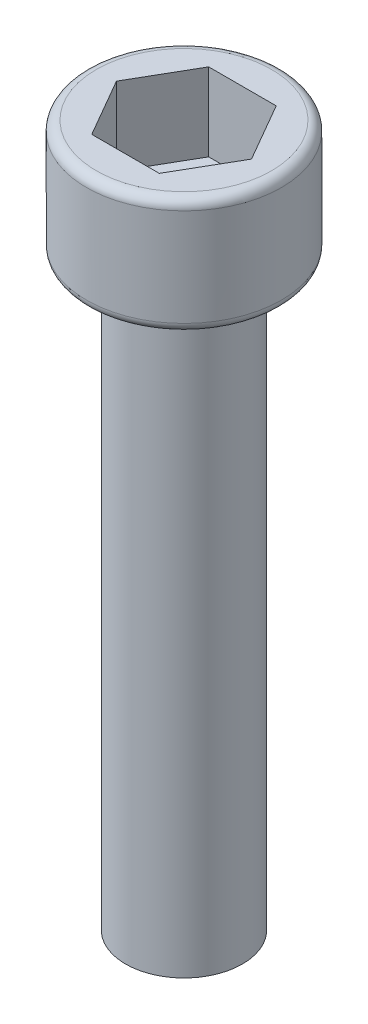
ISO-10303-21;
HEADER;
FILE_DESCRIPTION(('STEP AP214'),'2;1');
FILE_NAME('part.step','',(''),(''),'','','');
FILE_SCHEMA(('AUTOMOTIVE_DESIGN { 1 0 10303 214 1 1 1 1 }'));
ENDSEC;
DATA;
#1=APPLICATION_CONTEXT('core data for automotive mechanical design processes');
#2=APPLICATION_PROTOCOL_DEFINITION('international standard','automotive_design',2000,#1);
#3=PRODUCT_CONTEXT('',#1,'mechanical');
#4=PRODUCT('Part','Part','',(#3));
#5=PRODUCT_RELATED_PRODUCT_CATEGORY('part','',(#4));
#6=PRODUCT_DEFINITION_FORMATION('','',#4);
#7=PRODUCT_DEFINITION_CONTEXT('part definition',#1,'design');
#8=PRODUCT_DEFINITION('design','',#6,#7);
#9=PRODUCT_DEFINITION_SHAPE('','',#8);
#10=(LENGTH_UNIT() NAMED_UNIT(*) SI_UNIT(.MILLI.,.METRE.));
#11=(NAMED_UNIT(*) PLANE_ANGLE_UNIT() SI_UNIT($,.RADIAN.));
#12=(NAMED_UNIT(*) SI_UNIT($,.STERADIAN.) SOLID_ANGLE_UNIT());
#13=UNCERTAINTY_MEASURE_WITH_UNIT(LENGTH_MEASURE(1.E-05),#10,'distance_accuracy_value','');
#14=(GEOMETRIC_REPRESENTATION_CONTEXT(3) GLOBAL_UNCERTAINTY_ASSIGNED_CONTEXT((#13)) GLOBAL_UNIT_ASSIGNED_CONTEXT((#10,
#11,#12)) REPRESENTATION_CONTEXT('',''));
#15=CARTESIAN_POINT('',(0.,0.,0.));
#16=DIRECTION('',(0.,0.,1.));
#17=DIRECTION('',(1.,0.,0.));
#18=AXIS2_PLACEMENT_3D('',#15,#16,#17);
#19=CARTESIAN_POINT('',(0.,-9.,0.));
#20=DIRECTION('',(0.,-1.,0.));
#21=DIRECTION('',(1.,0.,0.));
#22=AXIS2_PLACEMENT_3D('',#19,#20,#21);
#23=PLANE('',#22);
#24=CARTESIAN_POINT('',(0.,-9.00000000000001,0.));
#25=DIRECTION('',(0.,-1.,0.));
#26=DIRECTION('',(1.,0.,0.));
#27=AXIS2_PLACEMENT_3D('',#24,#25,#26);
#28=CIRCLE('',#27,1.49999999999997);
#29=CARTESIAN_POINT('',(1.5,-9.,0.));
#30=VERTEX_POINT('',#29);
#31=EDGE_CURVE('E144',#30,#30,#28,.T.);
#32=ORIENTED_EDGE('',*,*,#31,.T.);
#33=EDGE_LOOP('',(#32));
#34=FACE_BOUND('',#33,.T.);
#35=ADVANCED_FACE('F34',(#34),#23,.T.);
#36=CARTESIAN_POINT('',(3.42844774755202E-12,-1000.,0.));
#37=DIRECTION('',(0.,-1.,0.));
#38=DIRECTION('',(1.,0.,0.));
#39=AXIS2_PLACEMENT_3D('',#36,#37,#38);
#40=CYLINDRICAL_SURFACE('',#39,1.5);
#41=CARTESIAN_POINT('',(0.,6.00000000000001,0.));
#42=DIRECTION('',(0.,-1.,0.));
#43=DIRECTION('',(1.,0.,0.));
#44=AXIS2_PLACEMENT_3D('',#41,#42,#43);
#45=CIRCLE('',#44,1.50000000000002);
#46=CARTESIAN_POINT('',(1.5,6.00000000000001,0.));
#47=VERTEX_POINT('',#46);
#48=EDGE_CURVE('E136',#47,#47,#45,.T.);
#49=ORIENTED_EDGE('',*,*,#48,.T.);
#50=EDGE_LOOP('',(#49));
#51=FACE_BOUND('',#50,.T.);
#52=ORIENTED_EDGE('',*,*,#31,.F.);
#53=EDGE_LOOP('',(#52));
#54=FACE_BOUND('',#53,.T.);
#55=ADVANCED_FACE('F166',(#51,#54),#40,.T.);
#56=CARTESIAN_POINT('',(1.5,6.,0.));
#57=DIRECTION('',(0.,-1.,0.));
#58=DIRECTION('',(1.,0.,0.));
#59=AXIS2_PLACEMENT_3D('',#56,#57,#58);
#60=PLANE('',#59);
#61=CARTESIAN_POINT('',(0.,5.99999999999999,0.));
#62=DIRECTION('',(0.,-1.,0.));
#63=DIRECTION('',(1.,0.,0.));
#64=AXIS2_PLACEMENT_3D('',#61,#62,#63);
#65=CIRCLE('',#64,2.25000000000003);
#66=CARTESIAN_POINT('',(2.25000000000001,6.,0.));
#67=VERTEX_POINT('',#66);
#68=EDGE_CURVE('E147',#67,#67,#65,.T.);
#69=ORIENTED_EDGE('',*,*,#68,.T.);
#70=EDGE_LOOP('',(#69));
#71=FACE_BOUND('',#70,.T.);
#72=ORIENTED_EDGE('',*,*,#48,.F.);
#73=EDGE_LOOP('',(#72));
#74=FACE_BOUND('',#73,.T.);
#75=ADVANCED_FACE('F163',(#71,#74),#60,.T.);
#76=CARTESIAN_POINT('',(3.42844774755202E-12,-1000.,0.));
#77=DIRECTION('',(0.,-1.,0.));
#78=DIRECTION('',(1.,0.,0.));
#79=AXIS2_PLACEMENT_3D('',#76,#77,#78);
#80=CYLINDRICAL_SURFACE('',#79,2.50000000000003);
#81=CARTESIAN_POINT('',(0.,6.25000000000009,0.));
#82=DIRECTION('',(0.,-1.,0.));
#83=DIRECTION('',(1.,0.,0.));
#84=AXIS2_PLACEMENT_3D('',#81,#82,#83);
#85=CIRCLE('',#84,2.50000000000003);
#86=CARTESIAN_POINT('',(2.5,6.2500000000001,0.));
#87=VERTEX_POINT('',#86);
#88=EDGE_CURVE('E42',#87,#87,#85,.F.);
#89=ORIENTED_EDGE('',*,*,#88,.T.);
#90=EDGE_LOOP('',(#89));
#91=FACE_BOUND('',#90,.T.);
#92=CARTESIAN_POINT('',(0.,8.75000000000004,0.));
#93=DIRECTION('',(0.,1.,0.));
#94=DIRECTION('',(-1.,0.,0.));
#95=AXIS2_PLACEMENT_3D('',#92,#93,#94);
#96=CIRCLE('',#95,2.50000000000003);
#97=CARTESIAN_POINT('',(-2.50000000000006,8.75000000000003,0.));
#98=VERTEX_POINT('',#97);
#99=EDGE_CURVE('E150',#98,#98,#96,.F.);
#100=ORIENTED_EDGE('',*,*,#99,.T.);
#101=EDGE_LOOP('',(#100));
#102=FACE_BOUND('',#101,.T.);
#103=ADVANCED_FACE('F155',(#91,#102),#80,.T.);
#104=CARTESIAN_POINT('',(2.5,9.,0.));
#105=DIRECTION('',(0.,1.,0.));
#106=DIRECTION('',(-1.,0.,0.));
#107=AXIS2_PLACEMENT_3D('',#104,#105,#106);
#108=PLANE('',#107);
#109=CARTESIAN_POINT('',(0.,8.99999999999999,0.));
#110=DIRECTION('',(0.,1.,0.));
#111=DIRECTION('',(-1.,0.,0.));
#112=AXIS2_PLACEMENT_3D('',#109,#110,#111);
#113=CIRCLE('',#112,2.25000000000003);
#114=CARTESIAN_POINT('',(-2.25000000000006,8.99999999999999,0.));
#115=VERTEX_POINT('',#114);
#116=EDGE_CURVE('E11',#115,#115,#113,.T.);
#117=ORIENTED_EDGE('',*,*,#116,.T.);
#118=EDGE_LOOP('',(#117));
#119=FACE_BOUND('',#118,.T.);
#120=DIRECTION('',(-0.5,0.,-0.866025403784438));
#121=VECTOR('',#120,1.);
#122=CARTESIAN_POINT('',(1.73205080756885,9.,0.));
#123=LINE('',#122,#121);
#124=CARTESIAN_POINT('',(1.73205080756885,9.,0.));
#125=VERTEX_POINT('',#124);
#126=CARTESIAN_POINT('',(0.866025403784415,9.,-1.5));
#127=VERTEX_POINT('',#126);
#128=EDGE_CURVE('E49',#125,#127,#123,.T.);
#129=ORIENTED_EDGE('',*,*,#128,.F.);
#130=DIRECTION('',(0.5,0.,-0.866025403784439));
#131=VECTOR('',#130,1.);
#132=CARTESIAN_POINT('',(0.866025403784409,9.,1.5));
#133=LINE('',#132,#131);
#134=CARTESIAN_POINT('',(0.866025403784409,9.,1.5));
#135=VERTEX_POINT('',#134);
#136=EDGE_CURVE('E132',#135,#125,#133,.T.);
#137=ORIENTED_EDGE('',*,*,#136,.F.);
#138=DIRECTION('',(1.,0.,0.));
#139=VECTOR('',#138,1.);
#140=CARTESIAN_POINT('',(-0.866025403784468,8.99999999999999,1.5));
#141=LINE('',#140,#139);
#142=CARTESIAN_POINT('',(-0.866025403784468,8.99999999999999,1.5));
#143=VERTEX_POINT('',#142);
#144=EDGE_CURVE('E130',#143,#135,#141,.T.);
#145=ORIENTED_EDGE('',*,*,#144,.F.);
#146=DIRECTION('',(0.5,0.,0.866025403784438));
#147=VECTOR('',#146,1.);
#148=CARTESIAN_POINT('',(-1.73205080756891,8.99999999999999,0.));
#149=LINE('',#148,#147);
#150=CARTESIAN_POINT('',(-1.73205080756891,8.99999999999999,0.));
#151=VERTEX_POINT('',#150);
#152=EDGE_CURVE('E97',#151,#143,#149,.T.);
#153=ORIENTED_EDGE('',*,*,#152,.F.);
#154=DIRECTION('',(-0.499999999999999,0.,0.866025403784439));
#155=VECTOR('',#154,1.);
#156=CARTESIAN_POINT('',(-0.86602540378447,8.99999999999999,-1.5));
#157=LINE('',#156,#155);
#158=CARTESIAN_POINT('',(-0.86602540378447,8.99999999999999,-1.5));
#159=VERTEX_POINT('',#158);
#160=EDGE_CURVE('E126',#159,#151,#157,.T.);
#161=ORIENTED_EDGE('',*,*,#160,.F.);
#162=DIRECTION('',(-1.,0.,0.));
#163=VECTOR('',#162,1.);
#164=CARTESIAN_POINT('',(0.866025403784408,9.,-1.5));
#165=LINE('',#164,#163);
#166=EDGE_CURVE('E123',#127,#159,#165,.T.);
#167=ORIENTED_EDGE('',*,*,#166,.F.);
#168=EDGE_LOOP('',(#129,#137,#145,#153,#161,#167));
#169=FACE_BOUND('',#168,.T.);
#170=ADVANCED_FACE('F182',(#119,#169),#108,.T.);
#171=CARTESIAN_POINT('',(1.73205080756885,7.,0.));
#172=DIRECTION('',(0.866025403784439,0.,-0.5));
#173=DIRECTION('',(-0.5,0.,-0.866025403784438));
#174=AXIS2_PLACEMENT_3D('',#171,#172,#173);
#175=PLANE('',#174);
#176=ORIENTED_EDGE('',*,*,#128,.T.);
#177=DIRECTION('',(0.,1.,0.));
#178=VECTOR('',#177,1.);
#179=CARTESIAN_POINT('',(0.866025403784415,7.,-1.5));
#180=LINE('',#179,#178);
#181=CARTESIAN_POINT('',(0.866025403784415,7.,-1.5));
#182=VERTEX_POINT('',#181);
#183=EDGE_CURVE('E79',#182,#127,#180,.T.);
#184=ORIENTED_EDGE('',*,*,#183,.F.);
#185=DIRECTION('',(-0.5,0.,-0.866025403784438));
#186=VECTOR('',#185,1.);
#187=CARTESIAN_POINT('',(1.73205080756885,7.,0.));
#188=LINE('',#187,#186);
#189=CARTESIAN_POINT('',(1.73205080756885,7.,0.));
#190=VERTEX_POINT('',#189);
#191=EDGE_CURVE('E134',#190,#182,#188,.T.);
#192=ORIENTED_EDGE('',*,*,#191,.F.);
#193=DIRECTION('',(0.,1.,0.));
#194=VECTOR('',#193,1.);
#195=CARTESIAN_POINT('',(1.73205080756885,7.,0.));
#196=LINE('',#195,#194);
#197=EDGE_CURVE('E57',#190,#125,#196,.T.);
#198=ORIENTED_EDGE('',*,*,#197,.T.);
#199=EDGE_LOOP('',(#176,#184,#192,#198));
#200=FACE_BOUND('',#199,.T.);
#201=ADVANCED_FACE('F185',(#200),#175,.F.);
#202=CARTESIAN_POINT('',(0.866025403784415,7.,1.5));
#203=DIRECTION('',(0.866025403784439,0.,0.5));
#204=DIRECTION('',(0.5,0.,-0.866025403784439));
#205=AXIS2_PLACEMENT_3D('',#202,#203,#204);
#206=PLANE('',#205);
#207=ORIENTED_EDGE('',*,*,#136,.T.);
#208=ORIENTED_EDGE('',*,*,#197,.F.);
#209=DIRECTION('',(0.5,0.,-0.866025403784439));
#210=VECTOR('',#209,1.);
#211=CARTESIAN_POINT('',(0.866025403784415,7.,1.5));
#212=LINE('',#211,#210);
#213=CARTESIAN_POINT('',(0.866025403784415,7.,1.5));
#214=VERTEX_POINT('',#213);
#215=EDGE_CURVE('E109',#214,#190,#212,.T.);
#216=ORIENTED_EDGE('',*,*,#215,.F.);
#217=DIRECTION('',(0.,1.,0.));
#218=VECTOR('',#217,1.);
#219=CARTESIAN_POINT('',(0.866025403784415,7.,1.5));
#220=LINE('',#219,#218);
#221=EDGE_CURVE('E101',#214,#135,#220,.T.);
#222=ORIENTED_EDGE('',*,*,#221,.T.);
#223=EDGE_LOOP('',(#207,#208,#216,#222));
#224=FACE_BOUND('',#223,.T.);
#225=ADVANCED_FACE('F189',(#224),#206,.F.);
#226=CARTESIAN_POINT('',(-0.866025403784462,6.99999999999999,1.5));
#227=DIRECTION('',(0.,0.,1.));
#228=DIRECTION('',(1.,0.,0.));
#229=AXIS2_PLACEMENT_3D('',#226,#227,#228);
#230=PLANE('',#229);
#231=ORIENTED_EDGE('',*,*,#144,.T.);
#232=ORIENTED_EDGE('',*,*,#221,.F.);
#233=DIRECTION('',(1.,0.,0.));
#234=VECTOR('',#233,1.);
#235=CARTESIAN_POINT('',(-0.866025403784462,6.99999999999999,1.5));
#236=LINE('',#235,#234);
#237=CARTESIAN_POINT('',(-0.866025403784462,6.99999999999999,1.5));
#238=VERTEX_POINT('',#237);
#239=EDGE_CURVE('E105',#238,#214,#236,.T.);
#240=ORIENTED_EDGE('',*,*,#239,.F.);
#241=DIRECTION('',(0.,1.,0.));
#242=VECTOR('',#241,1.);
#243=CARTESIAN_POINT('',(-0.866025403784462,6.99999999999999,1.5));
#244=LINE('',#243,#242);
#245=EDGE_CURVE('E90',#238,#143,#244,.T.);
#246=ORIENTED_EDGE('',*,*,#245,.T.);
#247=EDGE_LOOP('',(#231,#232,#240,#246));
#248=FACE_BOUND('',#247,.T.);
#249=ADVANCED_FACE('F106',(#248),#230,.F.);
#250=CARTESIAN_POINT('',(-1.7320508075689,6.99999999999999,0.));
#251=DIRECTION('',(-0.866025403784438,0.,0.5));
#252=DIRECTION('',(0.5,0.,0.866025403784438));
#253=AXIS2_PLACEMENT_3D('',#250,#251,#252);
#254=PLANE('',#253);
#255=ORIENTED_EDGE('',*,*,#152,.T.);
#256=ORIENTED_EDGE('',*,*,#245,.F.);
#257=DIRECTION('',(0.5,0.,0.866025403784438));
#258=VECTOR('',#257,1.);
#259=CARTESIAN_POINT('',(-1.7320508075689,6.99999999999999,0.));
#260=LINE('',#259,#258);
#261=CARTESIAN_POINT('',(-1.7320508075689,6.99999999999999,0.));
#262=VERTEX_POINT('',#261);
#263=EDGE_CURVE('E94',#262,#238,#260,.T.);
#264=ORIENTED_EDGE('',*,*,#263,.F.);
#265=DIRECTION('',(0.,1.,0.));
#266=VECTOR('',#265,1.);
#267=CARTESIAN_POINT('',(-1.7320508075689,6.99999999999999,0.));
#268=LINE('',#267,#266);
#269=EDGE_CURVE('E102',#262,#151,#268,.T.);
#270=ORIENTED_EDGE('',*,*,#269,.T.);
#271=EDGE_LOOP('',(#255,#256,#264,#270));
#272=FACE_BOUND('',#271,.T.);
#273=ADVANCED_FACE('F92',(#272),#254,.F.);
#274=CARTESIAN_POINT('',(-0.866025403784463,6.99999999999999,-1.5));
#275=DIRECTION('',(-0.866025403784439,0.,-0.499999999999999));
#276=DIRECTION('',(-0.5,0.,0.866025403784439));
#277=AXIS2_PLACEMENT_3D('',#274,#275,#276);
#278=PLANE('',#277);
#279=ORIENTED_EDGE('',*,*,#160,.T.);
#280=ORIENTED_EDGE('',*,*,#269,.F.);
#281=DIRECTION('',(-0.499999999999999,0.,0.866025403784439));
#282=VECTOR('',#281,1.);
#283=CARTESIAN_POINT('',(-0.866025403784463,6.99999999999999,-1.5));
#284=LINE('',#283,#282);
#285=CARTESIAN_POINT('',(-0.866025403784463,6.99999999999999,-1.5));
#286=VERTEX_POINT('',#285);
#287=EDGE_CURVE('E115',#286,#262,#284,.T.);
#288=ORIENTED_EDGE('',*,*,#287,.F.);
#289=DIRECTION('',(0.,1.,0.));
#290=VECTOR('',#289,1.);
#291=CARTESIAN_POINT('',(-0.866025403784463,6.99999999999999,-1.5));
#292=LINE('',#291,#290);
#293=EDGE_CURVE('E139',#286,#159,#292,.T.);
#294=ORIENTED_EDGE('',*,*,#293,.T.);
#295=EDGE_LOOP('',(#279,#280,#288,#294));
#296=FACE_BOUND('',#295,.T.);
#297=ADVANCED_FACE('F193',(#296),#278,.F.);
#298=CARTESIAN_POINT('',(0.866025403784415,7.,-1.5));
#299=DIRECTION('',(0.,0.,-1.));
#300=DIRECTION('',(-1.,0.,0.));
#301=AXIS2_PLACEMENT_3D('',#298,#299,#300);
#302=PLANE('',#301);
#303=ORIENTED_EDGE('',*,*,#166,.T.);
#304=ORIENTED_EDGE('',*,*,#293,.F.);
#305=DIRECTION('',(-1.,0.,0.));
#306=VECTOR('',#305,1.);
#307=CARTESIAN_POINT('',(0.866025403784415,7.,-1.5));
#308=LINE('',#307,#306);
#309=EDGE_CURVE('E117',#182,#286,#308,.T.);
#310=ORIENTED_EDGE('',*,*,#309,.F.);
#311=ORIENTED_EDGE('',*,*,#183,.T.);
#312=EDGE_LOOP('',(#303,#304,#310,#311));
#313=FACE_BOUND('',#312,.T.);
#314=ADVANCED_FACE('F190',(#313),#302,.F.);
#315=CARTESIAN_POINT('',(0.,6.99999999999999,0.));
#316=DIRECTION('',(0.,1.,0.));
#317=DIRECTION('',(-1.,0.,0.));
#318=AXIS2_PLACEMENT_3D('',#315,#316,#317);
#319=PLANE('',#318);
#320=ORIENTED_EDGE('',*,*,#191,.T.);
#321=ORIENTED_EDGE('',*,*,#309,.T.);
#322=ORIENTED_EDGE('',*,*,#287,.T.);
#323=ORIENTED_EDGE('',*,*,#263,.T.);
#324=ORIENTED_EDGE('',*,*,#239,.T.);
#325=ORIENTED_EDGE('',*,*,#215,.T.);
#326=EDGE_LOOP('',(#320,#321,#322,#323,#324,#325));
#327=FACE_BOUND('',#326,.T.);
#328=ADVANCED_FACE('F112',(#327),#319,.T.);
#329=CARTESIAN_POINT('',(0.,6.25000000000009,0.));
#330=DIRECTION('',(0.,-1.,0.));
#331=DIRECTION('',(1.,0.,0.));
#332=AXIS2_PLACEMENT_3D('',#329,#330,#331);
#333=TOROIDAL_SURFACE('',#332,2.25000000000003,0.25);
#334=ORIENTED_EDGE('',*,*,#88,.F.);
#335=EDGE_LOOP('',(#334));
#336=FACE_BOUND('',#335,.T.);
#337=ORIENTED_EDGE('',*,*,#68,.F.);
#338=EDGE_LOOP('',(#337));
#339=FACE_BOUND('',#338,.T.);
#340=ADVANCED_FACE('F158',(#336,#339),#333,.T.);
#341=CARTESIAN_POINT('',(0.,8.75000000000004,0.));
#342=DIRECTION('',(0.,1.,0.));
#343=DIRECTION('',(-1.,0.,0.));
#344=AXIS2_PLACEMENT_3D('',#341,#342,#343);
#345=TOROIDAL_SURFACE('',#344,2.25000000000003,0.25);
#346=ORIENTED_EDGE('',*,*,#116,.F.);
#347=EDGE_LOOP('',(#346));
#348=FACE_BOUND('',#347,.T.);
#349=ORIENTED_EDGE('',*,*,#99,.F.);
#350=EDGE_LOOP('',(#349));
#351=FACE_BOUND('',#350,.T.);
#352=ADVANCED_FACE('F36',(#348,#351),#345,.T.);
#353=CLOSED_SHELL('',(#35,#55,#75,#103,#170,#201,#225,#249,#273,#297,#314,#328,#340,#352));
#354=MANIFOLD_SOLID_BREP('B2',#353);
#355=ADVANCED_BREP_SHAPE_REPRESENTATION('',(#18,#354),#14);
#356=SHAPE_DEFINITION_REPRESENTATION(#9,#355);
ENDSEC;
END-ISO-10303-21;
